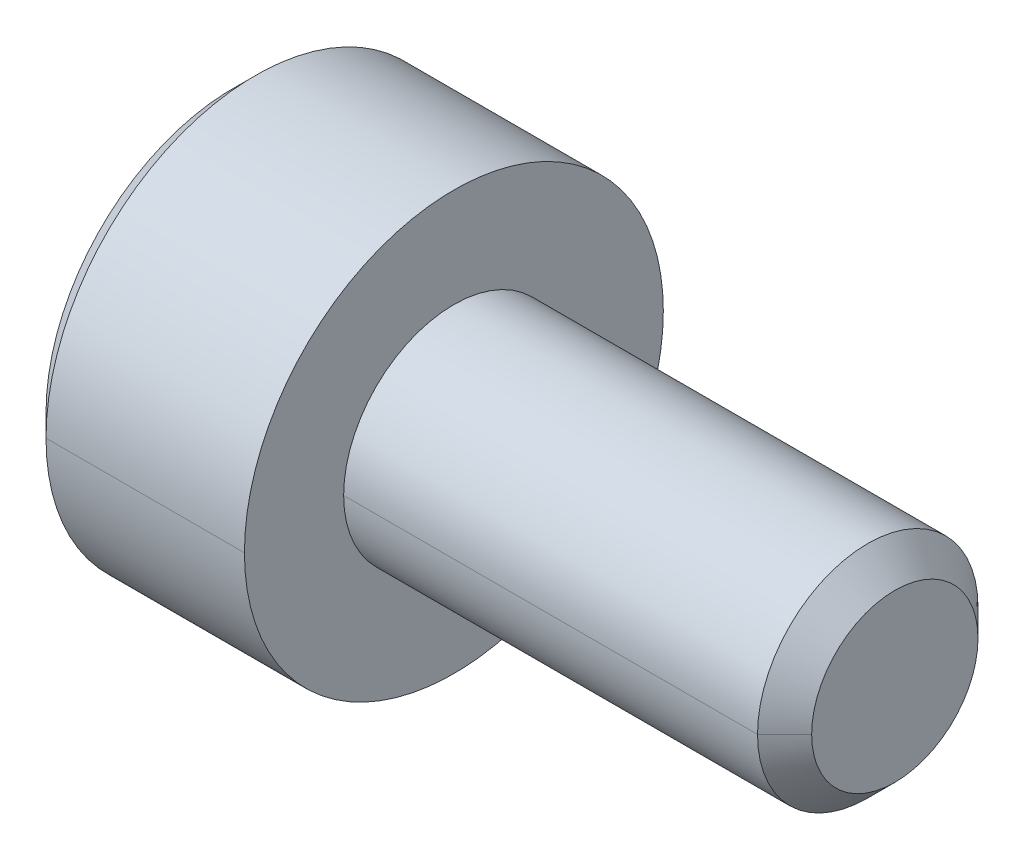
ISO-10303-21;
HEADER;
FILE_DESCRIPTION(('STEP AP214'),'2;1');
FILE_NAME('part.step','',(''),(''),'','','');
FILE_SCHEMA(('AUTOMOTIVE_DESIGN { 1 0 10303 214 1 1 1 1 }'));
ENDSEC;
DATA;
#1=APPLICATION_CONTEXT('core data for automotive mechanical design processes');
#2=APPLICATION_PROTOCOL_DEFINITION('international standard','automotive_design',2000,#1);
#3=PRODUCT_CONTEXT('',#1,'mechanical');
#4=PRODUCT('Part','Part','',(#3));
#5=PRODUCT_RELATED_PRODUCT_CATEGORY('part','',(#4));
#6=PRODUCT_DEFINITION_FORMATION('','',#4);
#7=PRODUCT_DEFINITION_CONTEXT('part definition',#1,'design');
#8=PRODUCT_DEFINITION('design','',#6,#7);
#9=PRODUCT_DEFINITION_SHAPE('','',#8);
#10=(LENGTH_UNIT() NAMED_UNIT(*) SI_UNIT(.MILLI.,.METRE.));
#11=(NAMED_UNIT(*) PLANE_ANGLE_UNIT() SI_UNIT($,.RADIAN.));
#12=(NAMED_UNIT(*) SI_UNIT($,.STERADIAN.) SOLID_ANGLE_UNIT());
#13=UNCERTAINTY_MEASURE_WITH_UNIT(LENGTH_MEASURE(1.E-05),#10,'distance_accuracy_value','');
#14=(GEOMETRIC_REPRESENTATION_CONTEXT(3) GLOBAL_UNCERTAINTY_ASSIGNED_CONTEXT((#13)) GLOBAL_UNIT_ASSIGNED_CONTEXT((#10,
#11,#12)) REPRESENTATION_CONTEXT('',''));
#15=CARTESIAN_POINT('',(0.,0.,0.));
#16=DIRECTION('',(0.,0.,1.));
#17=DIRECTION('',(1.,0.,0.));
#18=AXIS2_PLACEMENT_3D('',#15,#16,#17);
#19=CARTESIAN_POINT('',(-2.,0.,0.));
#20=DIRECTION('',(1.,0.,0.));
#21=DIRECTION('',(0.,-1.,0.));
#22=AXIS2_PLACEMENT_3D('',#19,#20,#21);
#23=CONICAL_SURFACE('',#22,1.7,0.7853981634);
#24=CARTESIAN_POINT('',(-1.8,0.,0.));
#25=DIRECTION('',(1.,0.,0.));
#26=DIRECTION('',(0.,0.,-1.));
#27=AXIS2_PLACEMENT_3D('',#24,#25,#26);
#28=CIRCLE('',#27,1.9);
#29=CARTESIAN_POINT('',(-1.8,0.,-1.9));
#30=VERTEX_POINT('',#29);
#31=CARTESIAN_POINT('',(-1.80000000000051,0.,1.90000000000051));
#32=VERTEX_POINT('',#31);
#33=EDGE_CURVE('E13',#30,#32,#28,.T.);
#34=ORIENTED_EDGE('',*,*,#33,.F.);
#35=DIRECTION('',(0.707106781184743,0.,-0.707106781188352));
#36=VECTOR('',#35,1.);
#37=CARTESIAN_POINT('',(-2.,0.,-1.7));
#38=LINE('',#37,#36);
#39=CARTESIAN_POINT('',(-2.,0.,-1.7));
#40=VERTEX_POINT('',#39);
#41=EDGE_CURVE('E33',#40,#30,#38,.T.);
#42=ORIENTED_EDGE('',*,*,#41,.F.);
#43=CARTESIAN_POINT('',(-2.,0.,0.));
#44=DIRECTION('',(1.,0.,0.));
#45=DIRECTION('',(0.,0.,-1.));
#46=AXIS2_PLACEMENT_3D('',#43,#44,#45);
#47=CIRCLE('',#46,1.7);
#48=CARTESIAN_POINT('',(-2.,0.,1.7));
#49=VERTEX_POINT('',#48);
#50=EDGE_CURVE('E347',#40,#49,#47,.T.);
#51=ORIENTED_EDGE('',*,*,#50,.T.);
#52=DIRECTION('',(0.707106781184743,0.,0.707106781188352));
#53=VECTOR('',#52,1.);
#54=CARTESIAN_POINT('',(-2.,0.,1.7));
#55=LINE('',#54,#53);
#56=EDGE_CURVE('E343',#49,#32,#55,.T.);
#57=ORIENTED_EDGE('',*,*,#56,.T.);
#58=EDGE_LOOP('',(#34,#42,#51,#57));
#59=FACE_BOUND('',#58,.T.);
#60=ADVANCED_FACE('F25',(#59),#23,.T.);
#61=CARTESIAN_POINT('',(-2.,0.,0.));
#62=DIRECTION('',(1.,0.,0.));
#63=DIRECTION('',(0.,1.,0.));
#64=AXIS2_PLACEMENT_3D('',#61,#62,#63);
#65=CONICAL_SURFACE('',#64,1.7,0.7853981634);
#66=CARTESIAN_POINT('',(-2.,0.,0.));
#67=DIRECTION('',(1.,0.,0.));
#68=DIRECTION('',(0.,0.,-1.));
#69=AXIS2_PLACEMENT_3D('',#66,#67,#68);
#70=CIRCLE('',#69,1.7);
#71=EDGE_CURVE('E339',#49,#40,#70,.T.);
#72=ORIENTED_EDGE('',*,*,#71,.T.);
#73=ORIENTED_EDGE('',*,*,#41,.T.);
#74=CARTESIAN_POINT('',(-1.8,0.,0.));
#75=DIRECTION('',(1.,0.,0.));
#76=DIRECTION('',(0.,0.,-1.));
#77=AXIS2_PLACEMENT_3D('',#74,#75,#76);
#78=CIRCLE('',#77,1.9);
#79=EDGE_CURVE('E334',#32,#30,#78,.T.);
#80=ORIENTED_EDGE('',*,*,#79,.F.);
#81=ORIENTED_EDGE('',*,*,#56,.F.);
#82=EDGE_LOOP('',(#72,#73,#80,#81));
#83=FACE_BOUND('',#82,.T.);
#84=ADVANCED_FACE('F357',(#83),#65,.T.);
#85=CARTESIAN_POINT('',(4.,0.,0.));
#86=DIRECTION('',(-1.,0.,0.));
#87=DIRECTION('',(0.,1.,0.));
#88=AXIS2_PLACEMENT_3D('',#85,#86,#87);
#89=CYLINDRICAL_SURFACE('',#88,1.9);
#90=ORIENTED_EDGE('',*,*,#79,.T.);
#91=DIRECTION('',(-1.,0.,0.));
#92=VECTOR('',#91,1.);
#93=CARTESIAN_POINT('',(0.,0.,-1.9));
#94=LINE('',#93,#92);
#95=CARTESIAN_POINT('',(0.,0.,-1.9));
#96=VERTEX_POINT('',#95);
#97=EDGE_CURVE('E329',#96,#30,#94,.T.);
#98=ORIENTED_EDGE('',*,*,#97,.F.);
#99=CARTESIAN_POINT('',(0.,0.,0.));
#100=DIRECTION('',(1.,0.,0.));
#101=DIRECTION('',(0.,0.,-1.));
#102=AXIS2_PLACEMENT_3D('',#99,#100,#101);
#103=CIRCLE('',#102,1.9);
#104=CARTESIAN_POINT('',(0.,0.,1.9));
#105=VERTEX_POINT('',#104);
#106=EDGE_CURVE('E324',#105,#96,#103,.T.);
#107=ORIENTED_EDGE('',*,*,#106,.F.);
#108=DIRECTION('',(-1.,0.,0.));
#109=VECTOR('',#108,1.);
#110=CARTESIAN_POINT('',(0.,0.,1.9));
#111=LINE('',#110,#109);
#112=EDGE_CURVE('E319',#105,#32,#111,.T.);
#113=ORIENTED_EDGE('',*,*,#112,.T.);
#114=EDGE_LOOP('',(#90,#98,#107,#113));
#115=FACE_BOUND('',#114,.T.);
#116=ADVANCED_FACE('F362',(#115),#89,.T.);
#117=CARTESIAN_POINT('',(4.,0.,0.));
#118=DIRECTION('',(-1.,0.,0.));
#119=DIRECTION('',(0.,-1.,0.));
#120=AXIS2_PLACEMENT_3D('',#117,#118,#119);
#121=CYLINDRICAL_SURFACE('',#120,1.9);
#122=CARTESIAN_POINT('',(0.,0.,0.));
#123=DIRECTION('',(1.,0.,0.));
#124=DIRECTION('',(0.,0.,-1.));
#125=AXIS2_PLACEMENT_3D('',#122,#123,#124);
#126=CIRCLE('',#125,1.9);
#127=EDGE_CURVE('E314',#96,#105,#126,.T.);
#128=ORIENTED_EDGE('',*,*,#127,.F.);
#129=ORIENTED_EDGE('',*,*,#97,.T.);
#130=ORIENTED_EDGE('',*,*,#33,.T.);
#131=ORIENTED_EDGE('',*,*,#112,.F.);
#132=EDGE_LOOP('',(#128,#129,#130,#131));
#133=FACE_BOUND('',#132,.T.);
#134=ADVANCED_FACE('F366',(#133),#121,.T.);
#135=CARTESIAN_POINT('',(0.,1.9,0.));
#136=DIRECTION('',(-1.,0.,0.));
#137=DIRECTION('',(0.,0.,1.));
#138=AXIS2_PLACEMENT_3D('',#135,#136,#137);
#139=PLANE('',#138);
#140=CARTESIAN_POINT('',(0.,0.,0.));
#141=DIRECTION('',(1.,0.,0.));
#142=DIRECTION('',(0.,0.,-1.));
#143=AXIS2_PLACEMENT_3D('',#140,#141,#142);
#144=CIRCLE('',#143,1.);
#145=CARTESIAN_POINT('',(0.,0.,-1.));
#146=VERTEX_POINT('',#145);
#147=CARTESIAN_POINT('',(0.,0.,1.));
#148=VERTEX_POINT('',#147);
#149=EDGE_CURVE('E309',#146,#148,#144,.T.);
#150=ORIENTED_EDGE('',*,*,#149,.F.);
#151=CARTESIAN_POINT('',(0.,0.,0.));
#152=DIRECTION('',(1.,0.,0.));
#153=DIRECTION('',(0.,0.,-1.));
#154=AXIS2_PLACEMENT_3D('',#151,#152,#153);
#155=CIRCLE('',#154,1.);
#156=EDGE_CURVE('E304',#148,#146,#155,.T.);
#157=ORIENTED_EDGE('',*,*,#156,.F.);
#158=EDGE_LOOP('',(#150,#157));
#159=FACE_BOUND('',#158,.T.);
#160=ORIENTED_EDGE('',*,*,#127,.T.);
#161=ORIENTED_EDGE('',*,*,#106,.T.);
#162=EDGE_LOOP('',(#160,#161));
#163=FACE_BOUND('',#162,.T.);
#164=ADVANCED_FACE('F368',(#159,#163),#139,.F.);
#165=CARTESIAN_POINT('',(4.,0.,0.));
#166=DIRECTION('',(-1.,0.,0.));
#167=DIRECTION('',(0.,1.,0.));
#168=AXIS2_PLACEMENT_3D('',#165,#166,#167);
#169=CYLINDRICAL_SURFACE('',#168,1.);
#170=ORIENTED_EDGE('',*,*,#156,.T.);
#171=DIRECTION('',(-1.,0.,0.));
#172=VECTOR('',#171,1.);
#173=CARTESIAN_POINT('',(3.7545,0.,-1.));
#174=LINE('',#173,#172);
#175=CARTESIAN_POINT('',(3.7545,0.,-1.));
#176=VERTEX_POINT('',#175);
#177=EDGE_CURVE('E299',#176,#146,#174,.T.);
#178=ORIENTED_EDGE('',*,*,#177,.F.);
#179=CARTESIAN_POINT('',(3.7545,0.,0.));
#180=DIRECTION('',(1.,0.,0.));
#181=DIRECTION('',(0.,0.,-1.));
#182=AXIS2_PLACEMENT_3D('',#179,#180,#181);
#183=CIRCLE('',#182,1.);
#184=CARTESIAN_POINT('',(3.7545,0.,1.));
#185=VERTEX_POINT('',#184);
#186=EDGE_CURVE('E294',#185,#176,#183,.T.);
#187=ORIENTED_EDGE('',*,*,#186,.F.);
#188=DIRECTION('',(-1.,0.,0.));
#189=VECTOR('',#188,1.);
#190=CARTESIAN_POINT('',(3.7545,0.,1.));
#191=LINE('',#190,#189);
#192=EDGE_CURVE('E289',#185,#148,#191,.T.);
#193=ORIENTED_EDGE('',*,*,#192,.T.);
#194=EDGE_LOOP('',(#170,#178,#187,#193));
#195=FACE_BOUND('',#194,.T.);
#196=ADVANCED_FACE('F370',(#195),#169,.T.);
#197=CARTESIAN_POINT('',(4.,0.,0.));
#198=DIRECTION('',(-1.,0.,0.));
#199=DIRECTION('',(0.,-1.,0.));
#200=AXIS2_PLACEMENT_3D('',#197,#198,#199);
#201=CYLINDRICAL_SURFACE('',#200,1.);
#202=CARTESIAN_POINT('',(3.7545,0.,0.));
#203=DIRECTION('',(1.,0.,0.));
#204=DIRECTION('',(0.,0.,-1.));
#205=AXIS2_PLACEMENT_3D('',#202,#203,#204);
#206=CIRCLE('',#205,1.);
#207=EDGE_CURVE('E284',#176,#185,#206,.T.);
#208=ORIENTED_EDGE('',*,*,#207,.F.);
#209=ORIENTED_EDGE('',*,*,#177,.T.);
#210=ORIENTED_EDGE('',*,*,#149,.T.);
#211=ORIENTED_EDGE('',*,*,#192,.F.);
#212=EDGE_LOOP('',(#208,#209,#210,#211));
#213=FACE_BOUND('',#212,.T.);
#214=ADVANCED_FACE('F378',(#213),#201,.T.);
#215=CARTESIAN_POINT('',(3.7545,0.,0.));
#216=DIRECTION('',(-1.,0.,0.));
#217=DIRECTION('',(0.,-1.,0.));
#218=AXIS2_PLACEMENT_3D('',#215,#216,#217);
#219=CONICAL_SURFACE('',#218,1.,0.7853981634);
#220=CARTESIAN_POINT('',(4.,0.,0.));
#221=DIRECTION('',(1.,0.,0.));
#222=DIRECTION('',(0.,0.,-1.));
#223=AXIS2_PLACEMENT_3D('',#220,#221,#222);
#224=CIRCLE('',#223,0.7545);
#225=CARTESIAN_POINT('',(4.,0.,-0.7545));
#226=VERTEX_POINT('',#225);
#227=CARTESIAN_POINT('',(3.99999999999937,0.,0.754499999999374));
#228=VERTEX_POINT('',#227);
#229=EDGE_CURVE('E279',#226,#228,#224,.T.);
#230=ORIENTED_EDGE('',*,*,#229,.F.);
#231=DIRECTION('',(-0.707106781184743,0.,-0.707106781188352));
#232=VECTOR('',#231,1.);
#233=CARTESIAN_POINT('',(3.99999999999937,0.,-0.754499999999374));
#234=LINE('',#233,#232);
#235=EDGE_CURVE('E274',#226,#176,#234,.T.);
#236=ORIENTED_EDGE('',*,*,#235,.T.);
#237=ORIENTED_EDGE('',*,*,#207,.T.);
#238=DIRECTION('',(-0.707106781184743,0.,0.707106781188352));
#239=VECTOR('',#238,1.);
#240=CARTESIAN_POINT('',(3.99999999999937,0.,0.754499999999374));
#241=LINE('',#240,#239);
#242=EDGE_CURVE('E269',#228,#185,#241,.T.);
#243=ORIENTED_EDGE('',*,*,#242,.F.);
#244=EDGE_LOOP('',(#230,#236,#237,#243));
#245=FACE_BOUND('',#244,.T.);
#246=ADVANCED_FACE('F419',(#245),#219,.T.);
#247=CARTESIAN_POINT('',(3.7545,0.,0.));
#248=DIRECTION('',(-1.,0.,0.));
#249=DIRECTION('',(0.,1.,0.));
#250=AXIS2_PLACEMENT_3D('',#247,#248,#249);
#251=CONICAL_SURFACE('',#250,1.,0.7853981634);
#252=ORIENTED_EDGE('',*,*,#186,.T.);
#253=ORIENTED_EDGE('',*,*,#235,.F.);
#254=CARTESIAN_POINT('',(4.,0.,0.));
#255=DIRECTION('',(1.,0.,0.));
#256=DIRECTION('',(0.,0.,-1.));
#257=AXIS2_PLACEMENT_3D('',#254,#255,#256);
#258=CIRCLE('',#257,0.7545);
#259=EDGE_CURVE('E264',#228,#226,#258,.T.);
#260=ORIENTED_EDGE('',*,*,#259,.F.);
#261=ORIENTED_EDGE('',*,*,#242,.T.);
#262=EDGE_LOOP('',(#252,#253,#260,#261));
#263=FACE_BOUND('',#262,.T.);
#264=ADVANCED_FACE('F429',(#263),#251,.T.);
#265=CARTESIAN_POINT('',(4.,0.7545,0.));
#266=DIRECTION('',(-1.,0.,0.));
#267=DIRECTION('',(0.,0.,1.));
#268=AXIS2_PLACEMENT_3D('',#265,#266,#267);
#269=PLANE('',#268);
#270=ORIENTED_EDGE('',*,*,#229,.T.);
#271=ORIENTED_EDGE('',*,*,#259,.T.);
#272=EDGE_LOOP('',(#270,#271));
#273=FACE_BOUND('',#272,.T.);
#274=ADVANCED_FACE('F439',(#273),#269,.F.);
#275=CARTESIAN_POINT('',(-2.,0.,0.));
#276=DIRECTION('',(1.,0.,0.));
#277=DIRECTION('',(0.,0.,-1.));
#278=AXIS2_PLACEMENT_3D('',#275,#276,#277);
#279=PLANE('',#278);
#280=ORIENTED_EDGE('',*,*,#50,.F.);
#281=ORIENTED_EDGE('',*,*,#71,.F.);
#282=EDGE_LOOP('',(#280,#281));
#283=FACE_BOUND('',#282,.T.);
#284=DIRECTION('',(0.,0.500000000000001,-0.866025403784438));
#285=VECTOR('',#284,1.);
#286=CARTESIAN_POINT('',(-2.,-0.86602540378444,0.));
#287=LINE('',#286,#285);
#288=CARTESIAN_POINT('',(-2.,-0.86602540378444,0.));
#289=VERTEX_POINT('',#288);
#290=CARTESIAN_POINT('',(-2.,-0.43301270189222,-0.75));
#291=VERTEX_POINT('',#290);
#292=EDGE_CURVE('E260',#289,#291,#287,.T.);
#293=ORIENTED_EDGE('',*,*,#292,.T.);
#294=DIRECTION('',(0.,1.,0.));
#295=VECTOR('',#294,1.);
#296=CARTESIAN_POINT('',(-2.,-0.43301270189222,-0.75));
#297=LINE('',#296,#295);
#298=CARTESIAN_POINT('',(-2.,0.43301270189222,-0.75));
#299=VERTEX_POINT('',#298);
#300=EDGE_CURVE('E256',#291,#299,#297,.T.);
#301=ORIENTED_EDGE('',*,*,#300,.T.);
#302=DIRECTION('',(0.,0.500000000000001,0.866025403784438));
#303=VECTOR('',#302,1.);
#304=CARTESIAN_POINT('',(-2.,0.43301270189222,-0.75));
#305=LINE('',#304,#303);
#306=CARTESIAN_POINT('',(-2.,0.86602540378444,0.));
#307=VERTEX_POINT('',#306);
#308=EDGE_CURVE('E252',#299,#307,#305,.T.);
#309=ORIENTED_EDGE('',*,*,#308,.T.);
#310=DIRECTION('',(0.,-0.500000000000001,0.866025403784438));
#311=VECTOR('',#310,1.);
#312=CARTESIAN_POINT('',(-2.,0.86602540378444,0.));
#313=LINE('',#312,#311);
#314=CARTESIAN_POINT('',(-2.,0.43301270189222,0.75));
#315=VERTEX_POINT('',#314);
#316=EDGE_CURVE('E248',#307,#315,#313,.T.);
#317=ORIENTED_EDGE('',*,*,#316,.T.);
#318=DIRECTION('',(0.,-1.,0.));
#319=VECTOR('',#318,1.);
#320=CARTESIAN_POINT('',(-2.,0.43301270189222,0.75));
#321=LINE('',#320,#319);
#322=CARTESIAN_POINT('',(-2.,-0.43301270189222,0.75));
#323=VERTEX_POINT('',#322);
#324=EDGE_CURVE('E244',#315,#323,#321,.T.);
#325=ORIENTED_EDGE('',*,*,#324,.T.);
#326=DIRECTION('',(0.,-0.500000000000001,-0.866025403784438));
#327=VECTOR('',#326,1.);
#328=CARTESIAN_POINT('',(-2.,-0.43301270189222,0.75));
#329=LINE('',#328,#327);
#330=EDGE_CURVE('E240',#323,#289,#329,.T.);
#331=ORIENTED_EDGE('',*,*,#330,.T.);
#332=EDGE_LOOP('',(#293,#301,#309,#317,#325,#331));
#333=FACE_BOUND('',#332,.T.);
#334=ADVANCED_FACE('F449',(#283,#333),#279,.F.);
#335=CARTESIAN_POINT('',(-1.,-0.43301270189222,0.75));
#336=DIRECTION('',(0.,0.866025403784438,-0.500000000000001));
#337=DIRECTION('',(0.,0.500000000000001,0.866025403784438));
#338=AXIS2_PLACEMENT_3D('',#335,#336,#337);
#339=PLANE('',#338);
#340=ORIENTED_EDGE('',*,*,#330,.F.);
#341=DIRECTION('',(-1.,0.,0.));
#342=VECTOR('',#341,1.);
#343=CARTESIAN_POINT('',(-1.,-0.43301270189222,0.75));
#344=LINE('',#343,#342);
#345=CARTESIAN_POINT('',(-1.,-0.43301270189222,0.75));
#346=VERTEX_POINT('',#345);
#347=EDGE_CURVE('E235',#346,#323,#344,.T.);
#348=ORIENTED_EDGE('',*,*,#347,.F.);
#349=DIRECTION('',(0.,-0.500000000000001,-0.866025403784438));
#350=VECTOR('',#349,1.);
#351=CARTESIAN_POINT('',(-1.,-0.43301270189222,0.75));
#352=LINE('',#351,#350);
#353=CARTESIAN_POINT('',(-1.,-0.64951905283833,0.375000000000001));
#354=VERTEX_POINT('',#353);
#355=EDGE_CURVE('E231',#346,#354,#352,.T.);
#356=ORIENTED_EDGE('',*,*,#355,.T.);
#357=DIRECTION('',(0.,-0.500000000000001,-0.866025403784438));
#358=VECTOR('',#357,1.);
#359=CARTESIAN_POINT('',(-1.,-0.43301270189222,0.75));
#360=LINE('',#359,#358);
#361=CARTESIAN_POINT('',(-1.,-0.86602540378444,0.));
#362=VERTEX_POINT('',#361);
#363=EDGE_CURVE('E227',#354,#362,#360,.T.);
#364=ORIENTED_EDGE('',*,*,#363,.T.);
#365=DIRECTION('',(-1.,0.,0.));
#366=VECTOR('',#365,1.);
#367=CARTESIAN_POINT('',(-1.,-0.86602540378444,0.));
#368=LINE('',#367,#366);
#369=EDGE_CURVE('E222',#362,#289,#368,.T.);
#370=ORIENTED_EDGE('',*,*,#369,.T.);
#371=EDGE_LOOP('',(#340,#348,#356,#364,#370));
#372=FACE_BOUND('',#371,.T.);
#373=ADVANCED_FACE('F459',(#372),#339,.T.);
#374=CARTESIAN_POINT('',(-1.,-0.86602540378444,0.));
#375=DIRECTION('',(0.,0.866025403784438,0.500000000000001));
#376=DIRECTION('',(0.,-0.500000000000001,0.866025403784438));
#377=AXIS2_PLACEMENT_3D('',#374,#375,#376);
#378=PLANE('',#377);
#379=ORIENTED_EDGE('',*,*,#292,.F.);
#380=ORIENTED_EDGE('',*,*,#369,.F.);
#381=DIRECTION('',(0.,0.500000000000001,-0.866025403784438));
#382=VECTOR('',#381,1.);
#383=CARTESIAN_POINT('',(-1.,-0.86602540378444,0.));
#384=LINE('',#383,#382);
#385=CARTESIAN_POINT('',(-1.,-0.649519052838329,-0.375));
#386=VERTEX_POINT('',#385);
#387=EDGE_CURVE('E218',#362,#386,#384,.T.);
#388=ORIENTED_EDGE('',*,*,#387,.T.);
#389=DIRECTION('',(0.,0.500000000000001,-0.866025403784438));
#390=VECTOR('',#389,1.);
#391=CARTESIAN_POINT('',(-1.,-0.86602540378444,0.));
#392=LINE('',#391,#390);
#393=CARTESIAN_POINT('',(-1.,-0.43301270189222,-0.75));
#394=VERTEX_POINT('',#393);
#395=EDGE_CURVE('E214',#386,#394,#392,.T.);
#396=ORIENTED_EDGE('',*,*,#395,.T.);
#397=DIRECTION('',(-1.,0.,0.));
#398=VECTOR('',#397,1.);
#399=CARTESIAN_POINT('',(-1.,-0.43301270189222,-0.75));
#400=LINE('',#399,#398);
#401=EDGE_CURVE('E209',#394,#291,#400,.T.);
#402=ORIENTED_EDGE('',*,*,#401,.T.);
#403=EDGE_LOOP('',(#379,#380,#388,#396,#402));
#404=FACE_BOUND('',#403,.T.);
#405=ADVANCED_FACE('F469',(#404),#378,.T.);
#406=CARTESIAN_POINT('',(-1.,-0.43301270189222,-0.75));
#407=DIRECTION('',(0.,0.,1.));
#408=DIRECTION('',(1.,0.,0.));
#409=AXIS2_PLACEMENT_3D('',#406,#407,#408);
#410=PLANE('',#409);
#411=ORIENTED_EDGE('',*,*,#300,.F.);
#412=ORIENTED_EDGE('',*,*,#401,.F.);
#413=DIRECTION('',(0.,1.,0.));
#414=VECTOR('',#413,1.);
#415=CARTESIAN_POINT('',(-1.,-0.43301270189222,-0.75));
#416=LINE('',#415,#414);
#417=CARTESIAN_POINT('',(-1.,0.,-0.75));
#418=VERTEX_POINT('',#417);
#419=EDGE_CURVE('E205',#394,#418,#416,.T.);
#420=ORIENTED_EDGE('',*,*,#419,.T.);
#421=DIRECTION('',(0.,1.,0.));
#422=VECTOR('',#421,1.);
#423=CARTESIAN_POINT('',(-1.,-0.43301270189222,-0.75));
#424=LINE('',#423,#422);
#425=CARTESIAN_POINT('',(-1.,0.43301270189222,-0.75));
#426=VERTEX_POINT('',#425);
#427=EDGE_CURVE('E201',#418,#426,#424,.T.);
#428=ORIENTED_EDGE('',*,*,#427,.T.);
#429=DIRECTION('',(-1.,0.,0.));
#430=VECTOR('',#429,1.);
#431=CARTESIAN_POINT('',(-1.,0.43301270189222,-0.75));
#432=LINE('',#431,#430);
#433=EDGE_CURVE('E196',#426,#299,#432,.T.);
#434=ORIENTED_EDGE('',*,*,#433,.T.);
#435=EDGE_LOOP('',(#411,#412,#420,#428,#434));
#436=FACE_BOUND('',#435,.T.);
#437=ADVANCED_FACE('F479',(#436),#410,.T.);
#438=CARTESIAN_POINT('',(-1.,0.43301270189222,-0.75));
#439=DIRECTION('',(0.,-0.866025403784438,0.500000000000001));
#440=DIRECTION('',(0.,-0.500000000000001,-0.866025403784438));
#441=AXIS2_PLACEMENT_3D('',#438,#439,#440);
#442=PLANE('',#441);
#443=ORIENTED_EDGE('',*,*,#308,.F.);
#444=ORIENTED_EDGE('',*,*,#433,.F.);
#445=DIRECTION('',(0.,0.500000000000001,0.866025403784438));
#446=VECTOR('',#445,1.);
#447=CARTESIAN_POINT('',(-1.,0.43301270189222,-0.75));
#448=LINE('',#447,#446);
#449=CARTESIAN_POINT('',(-1.,0.64951905283833,-0.375000000000001));
#450=VERTEX_POINT('',#449);
#451=EDGE_CURVE('E192',#426,#450,#448,.T.);
#452=ORIENTED_EDGE('',*,*,#451,.T.);
#453=DIRECTION('',(0.,0.500000000000001,0.866025403784438));
#454=VECTOR('',#453,1.);
#455=CARTESIAN_POINT('',(-1.,0.43301270189222,-0.75));
#456=LINE('',#455,#454);
#457=CARTESIAN_POINT('',(-1.,0.86602540378444,0.));
#458=VERTEX_POINT('',#457);
#459=EDGE_CURVE('E188',#450,#458,#456,.T.);
#460=ORIENTED_EDGE('',*,*,#459,.T.);
#461=DIRECTION('',(-1.,0.,0.));
#462=VECTOR('',#461,1.);
#463=CARTESIAN_POINT('',(-1.,0.86602540378444,0.));
#464=LINE('',#463,#462);
#465=EDGE_CURVE('E183',#458,#307,#464,.T.);
#466=ORIENTED_EDGE('',*,*,#465,.T.);
#467=EDGE_LOOP('',(#443,#444,#452,#460,#466));
#468=FACE_BOUND('',#467,.T.);
#469=ADVANCED_FACE('F489',(#468),#442,.T.);
#470=CARTESIAN_POINT('',(-1.,0.86602540378444,0.));
#471=DIRECTION('',(0.,-0.866025403784438,-0.500000000000001));
#472=DIRECTION('',(0.,0.500000000000001,-0.866025403784438));
#473=AXIS2_PLACEMENT_3D('',#470,#471,#472);
#474=PLANE('',#473);
#475=ORIENTED_EDGE('',*,*,#316,.F.);
#476=ORIENTED_EDGE('',*,*,#465,.F.);
#477=DIRECTION('',(0.,-0.500000000000001,0.866025403784438));
#478=VECTOR('',#477,1.);
#479=CARTESIAN_POINT('',(-1.,0.86602540378444,0.));
#480=LINE('',#479,#478);
#481=CARTESIAN_POINT('',(-1.,0.64951905283833,0.375000000000001));
#482=VERTEX_POINT('',#481);
#483=EDGE_CURVE('E179',#458,#482,#480,.T.);
#484=ORIENTED_EDGE('',*,*,#483,.T.);
#485=DIRECTION('',(0.,-0.500000000000001,0.866025403784438));
#486=VECTOR('',#485,1.);
#487=CARTESIAN_POINT('',(-1.,0.86602540378444,0.));
#488=LINE('',#487,#486);
#489=CARTESIAN_POINT('',(-1.,0.43301270189222,0.75));
#490=VERTEX_POINT('',#489);
#491=EDGE_CURVE('E175',#482,#490,#488,.T.);
#492=ORIENTED_EDGE('',*,*,#491,.T.);
#493=DIRECTION('',(-1.,0.,0.));
#494=VECTOR('',#493,1.);
#495=CARTESIAN_POINT('',(-1.,0.43301270189222,0.75));
#496=LINE('',#495,#494);
#497=EDGE_CURVE('E170',#490,#315,#496,.T.);
#498=ORIENTED_EDGE('',*,*,#497,.T.);
#499=EDGE_LOOP('',(#475,#476,#484,#492,#498));
#500=FACE_BOUND('',#499,.T.);
#501=ADVANCED_FACE('F499',(#500),#474,.T.);
#502=CARTESIAN_POINT('',(-1.,0.43301270189222,0.75));
#503=DIRECTION('',(0.,0.,-1.));
#504=DIRECTION('',(-1.,0.,0.));
#505=AXIS2_PLACEMENT_3D('',#502,#503,#504);
#506=PLANE('',#505);
#507=ORIENTED_EDGE('',*,*,#324,.F.);
#508=ORIENTED_EDGE('',*,*,#497,.F.);
#509=DIRECTION('',(0.,-1.,0.));
#510=VECTOR('',#509,1.);
#511=CARTESIAN_POINT('',(-1.,0.43301270189222,0.75));
#512=LINE('',#511,#510);
#513=CARTESIAN_POINT('',(-1.,0.,0.75));
#514=VERTEX_POINT('',#513);
#515=EDGE_CURVE('E166',#490,#514,#512,.T.);
#516=ORIENTED_EDGE('',*,*,#515,.T.);
#517=DIRECTION('',(0.,-1.,0.));
#518=VECTOR('',#517,1.);
#519=CARTESIAN_POINT('',(-1.,0.43301270189222,0.75));
#520=LINE('',#519,#518);
#521=EDGE_CURVE('E153',#514,#346,#520,.T.);
#522=ORIENTED_EDGE('',*,*,#521,.T.);
#523=ORIENTED_EDGE('',*,*,#347,.T.);
#524=EDGE_LOOP('',(#507,#508,#516,#522,#523));
#525=FACE_BOUND('',#524,.T.);
#526=ADVANCED_FACE('F509',(#525),#506,.T.);
#527=CARTESIAN_POINT('',(-1.,0.,0.));
#528=DIRECTION('',(1.,0.,0.));
#529=DIRECTION('',(0.,0.,-1.));
#530=AXIS2_PLACEMENT_3D('',#527,#528,#529);
#531=PLANE('',#530);
#532=CARTESIAN_POINT('',(-1.,0.,0.));
#533=DIRECTION('',(1.,0.,0.));
#534=DIRECTION('',(0.,0.,-1.));
#535=AXIS2_PLACEMENT_3D('',#532,#533,#534);
#536=CIRCLE('',#535,0.75);
#537=EDGE_CURVE('E139',#514,#354,#536,.T.);
#538=ORIENTED_EDGE('',*,*,#537,.T.);
#539=ORIENTED_EDGE('',*,*,#355,.F.);
#540=ORIENTED_EDGE('',*,*,#521,.F.);
#541=EDGE_LOOP('',(#538,#539,#540));
#542=FACE_BOUND('',#541,.T.);
#543=ADVANCED_FACE('F519',(#542),#531,.F.);
#544=CARTESIAN_POINT('',(-1.,0.,0.));
#545=DIRECTION('',(-1.,0.,0.));
#546=DIRECTION('',(0.,1.,0.));
#547=AXIS2_PLACEMENT_3D('',#544,#545,#546);
#548=CONICAL_SURFACE('',#547,0.75,1.308996939);
#549=DIRECTION('',(-0.258819045098413,0.,-0.965925826290169));
#550=VECTOR('',#549,1.);
#551=CARTESIAN_POINT('',(-0.799038105680077,0.,0.));
#552=LINE('',#551,#550);
#553=CARTESIAN_POINT('',(-0.79903810567666,0.,0.));
#554=VERTEX_POINT('',#553);
#555=EDGE_CURVE('E135',#554,#418,#552,.T.);
#556=ORIENTED_EDGE('',*,*,#555,.T.);
#557=CARTESIAN_POINT('',(-1.,0.,0.));
#558=DIRECTION('',(1.,0.,0.));
#559=DIRECTION('',(0.,0.,-1.));
#560=AXIS2_PLACEMENT_3D('',#557,#558,#559);
#561=CIRCLE('',#560,0.75);
#562=EDGE_CURVE('E151',#386,#418,#561,.T.);
#563=ORIENTED_EDGE('',*,*,#562,.F.);
#564=CARTESIAN_POINT('',(-1.,0.,0.));
#565=DIRECTION('',(1.,0.,0.));
#566=DIRECTION('',(0.,0.,-1.));
#567=AXIS2_PLACEMENT_3D('',#564,#565,#566);
#568=CIRCLE('',#567,0.75);
#569=EDGE_CURVE('E143',#354,#386,#568,.T.);
#570=ORIENTED_EDGE('',*,*,#569,.F.);
#571=ORIENTED_EDGE('',*,*,#537,.F.);
#572=DIRECTION('',(-0.258819045098413,0.,0.965925826290169));
#573=VECTOR('',#572,1.);
#574=CARTESIAN_POINT('',(-0.799038105680077,0.,0.));
#575=LINE('',#574,#573);
#576=EDGE_CURVE('E131',#554,#514,#575,.T.);
#577=ORIENTED_EDGE('',*,*,#576,.F.);
#578=EDGE_LOOP('',(#556,#563,#570,#571,#577));
#579=FACE_BOUND('',#578,.T.);
#580=ADVANCED_FACE('F133',(#579),#548,.F.);
#581=CARTESIAN_POINT('',(-1.,0.,0.));
#582=DIRECTION('',(-1.,0.,0.));
#583=DIRECTION('',(0.,-1.,0.));
#584=AXIS2_PLACEMENT_3D('',#581,#582,#583);
#585=CONICAL_SURFACE('',#584,0.75,1.308996939);
#586=ORIENTED_EDGE('',*,*,#576,.T.);
#587=CARTESIAN_POINT('',(-1.,0.,0.));
#588=DIRECTION('',(1.,0.,0.));
#589=DIRECTION('',(0.,0.,-1.));
#590=AXIS2_PLACEMENT_3D('',#587,#588,#589);
#591=CIRCLE('',#590,0.75);
#592=EDGE_CURVE('E144',#482,#514,#591,.T.);
#593=ORIENTED_EDGE('',*,*,#592,.F.);
#594=CARTESIAN_POINT('',(-1.,0.,0.));
#595=DIRECTION('',(1.,0.,0.));
#596=DIRECTION('',(0.,0.,-1.));
#597=AXIS2_PLACEMENT_3D('',#594,#595,#596);
#598=CIRCLE('',#597,0.75);
#599=EDGE_CURVE('E678',#450,#482,#598,.T.);
#600=ORIENTED_EDGE('',*,*,#599,.F.);
#601=CARTESIAN_POINT('',(-1.,0.,0.));
#602=DIRECTION('',(1.,0.,0.));
#603=DIRECTION('',(0.,0.,-1.));
#604=AXIS2_PLACEMENT_3D('',#601,#602,#603);
#605=CIRCLE('',#604,0.75);
#606=EDGE_CURVE('E149',#418,#450,#605,.T.);
#607=ORIENTED_EDGE('',*,*,#606,.F.);
#608=ORIENTED_EDGE('',*,*,#555,.F.);
#609=EDGE_LOOP('',(#586,#593,#600,#607,#608));
#610=FACE_BOUND('',#609,.T.);
#611=ADVANCED_FACE('F146',(#610),#585,.F.);
#612=CARTESIAN_POINT('',(-1.,0.,0.));
#613=DIRECTION('',(1.,0.,0.));
#614=DIRECTION('',(0.,0.,-1.));
#615=AXIS2_PLACEMENT_3D('',#612,#613,#614);
#616=PLANE('',#615);
#617=ORIENTED_EDGE('',*,*,#606,.T.);
#618=ORIENTED_EDGE('',*,*,#451,.F.);
#619=ORIENTED_EDGE('',*,*,#427,.F.);
#620=EDGE_LOOP('',(#617,#618,#619));
#621=FACE_BOUND('',#620,.T.);
#622=ADVANCED_FACE('F546',(#621),#616,.F.);
#623=CARTESIAN_POINT('',(-1.,0.,0.));
#624=DIRECTION('',(1.,0.,0.));
#625=DIRECTION('',(0.,0.,-1.));
#626=AXIS2_PLACEMENT_3D('',#623,#624,#625);
#627=PLANE('',#626);
#628=ORIENTED_EDGE('',*,*,#459,.F.);
#629=ORIENTED_EDGE('',*,*,#599,.T.);
#630=ORIENTED_EDGE('',*,*,#483,.F.);
#631=EDGE_LOOP('',(#628,#629,#630));
#632=FACE_BOUND('',#631,.T.);
#633=ADVANCED_FACE('F555',(#632),#627,.F.);
#634=CARTESIAN_POINT('',(-1.,0.,0.));
#635=DIRECTION('',(1.,0.,0.));
#636=DIRECTION('',(0.,0.,-1.));
#637=AXIS2_PLACEMENT_3D('',#634,#635,#636);
#638=PLANE('',#637);
#639=ORIENTED_EDGE('',*,*,#592,.T.);
#640=ORIENTED_EDGE('',*,*,#515,.F.);
#641=ORIENTED_EDGE('',*,*,#491,.F.);
#642=EDGE_LOOP('',(#639,#640,#641));
#643=FACE_BOUND('',#642,.T.);
#644=ADVANCED_FACE('F565',(#643),#638,.F.);
#645=CARTESIAN_POINT('',(-1.,0.,0.));
#646=DIRECTION('',(1.,0.,0.));
#647=DIRECTION('',(0.,0.,-1.));
#648=AXIS2_PLACEMENT_3D('',#645,#646,#647);
#649=PLANE('',#648);
#650=ORIENTED_EDGE('',*,*,#569,.T.);
#651=ORIENTED_EDGE('',*,*,#387,.F.);
#652=ORIENTED_EDGE('',*,*,#363,.F.);
#653=EDGE_LOOP('',(#650,#651,#652));
#654=FACE_BOUND('',#653,.T.);
#655=ADVANCED_FACE('F575',(#654),#649,.F.);
#656=CARTESIAN_POINT('',(-1.,0.,0.));
#657=DIRECTION('',(1.,0.,0.));
#658=DIRECTION('',(0.,0.,-1.));
#659=AXIS2_PLACEMENT_3D('',#656,#657,#658);
#660=PLANE('',#659);
#661=ORIENTED_EDGE('',*,*,#562,.T.);
#662=ORIENTED_EDGE('',*,*,#419,.F.);
#663=ORIENTED_EDGE('',*,*,#395,.F.);
#664=EDGE_LOOP('',(#661,#662,#663));
#665=FACE_BOUND('',#664,.T.);
#666=ADVANCED_FACE('F585',(#665),#660,.F.);
#667=CLOSED_SHELL('',(#60,#84,#116,#134,#164,#196,#214,#246,#264,#274,#334,#373,#405,#437,#469,
#501,#526,#543,#580,#611,#622,#633,#644,#655,#666));
#668=MANIFOLD_SOLID_BREP('B1',#667);
#669=ADVANCED_BREP_SHAPE_REPRESENTATION('',(#18,#668),#14);
#670=SHAPE_DEFINITION_REPRESENTATION(#9,#669);
ENDSEC;
END-ISO-10303-21;
